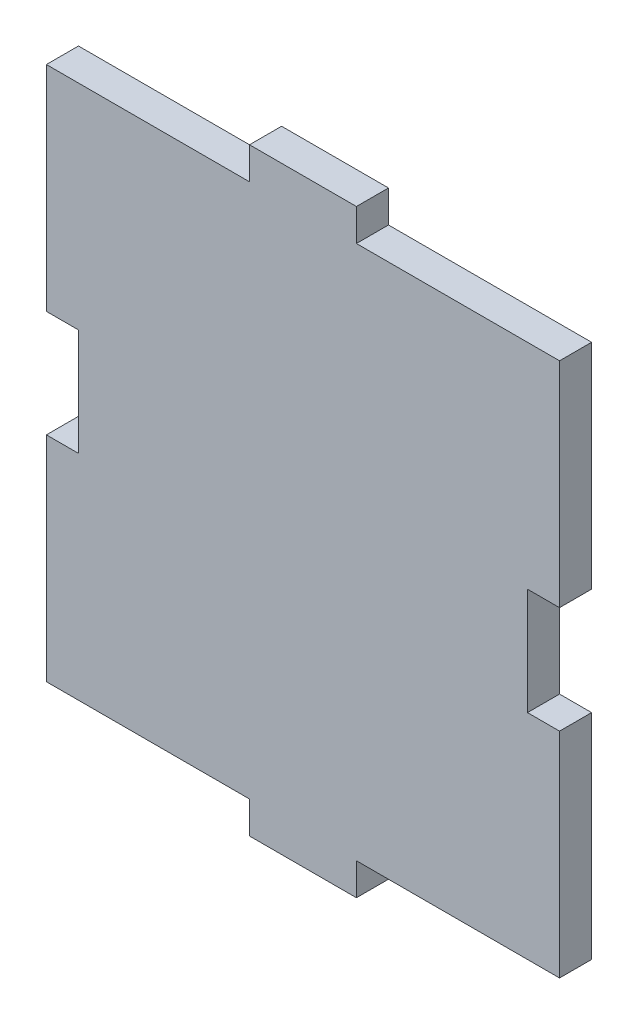
ISO-10303-21;
HEADER;
FILE_DESCRIPTION(('STEP AP214'),'2;1');
FILE_NAME('part.step','',(''),(''),'','','');
FILE_SCHEMA(('AUTOMOTIVE_DESIGN { 1 0 10303 214 1 1 1 1 }'));
ENDSEC;
DATA;
#1=APPLICATION_CONTEXT('core data for automotive mechanical design processes');
#2=APPLICATION_PROTOCOL_DEFINITION('international standard','automotive_design',2000,#1);
#3=PRODUCT_CONTEXT('',#1,'mechanical');
#4=PRODUCT('Part','Part','',(#3));
#5=PRODUCT_RELATED_PRODUCT_CATEGORY('part','',(#4));
#6=PRODUCT_DEFINITION_FORMATION('','',#4);
#7=PRODUCT_DEFINITION_CONTEXT('part definition',#1,'design');
#8=PRODUCT_DEFINITION('design','',#6,#7);
#9=PRODUCT_DEFINITION_SHAPE('','',#8);
#10=(LENGTH_UNIT() NAMED_UNIT(*) SI_UNIT(.MILLI.,.METRE.));
#11=(NAMED_UNIT(*) PLANE_ANGLE_UNIT() SI_UNIT($,.RADIAN.));
#12=(NAMED_UNIT(*) SI_UNIT($,.STERADIAN.) SOLID_ANGLE_UNIT());
#13=UNCERTAINTY_MEASURE_WITH_UNIT(LENGTH_MEASURE(1.E-05),#10,'distance_accuracy_value','');
#14=(GEOMETRIC_REPRESENTATION_CONTEXT(3) GLOBAL_UNCERTAINTY_ASSIGNED_CONTEXT((#13)) GLOBAL_UNIT_ASSIGNED_CONTEXT((#10,
#11,#12)) REPRESENTATION_CONTEXT('',''));
#15=CARTESIAN_POINT('',(0.,0.,0.));
#16=DIRECTION('',(0.,0.,1.));
#17=DIRECTION('',(1.,0.,0.));
#18=AXIS2_PLACEMENT_3D('',#15,#16,#17);
#19=CARTESIAN_POINT('',(-5.00000000000001,25.,3.));
#20=DIRECTION('',(0.,-1.,0.));
#21=DIRECTION('',(1.,0.,0.));
#22=AXIS2_PLACEMENT_3D('',#19,#20,#21);
#23=PLANE('',#22);
#24=DIRECTION('',(-1.,0.,0.));
#25=VECTOR('',#24,1.);
#26=CARTESIAN_POINT('',(-5.00000000000001,25.,0.));
#27=LINE('',#26,#25);
#28=CARTESIAN_POINT('',(-5.00000000000001,25.,0.));
#29=VERTEX_POINT('',#28);
#30=CARTESIAN_POINT('',(-24.,25.,0.));
#31=VERTEX_POINT('',#30);
#32=EDGE_CURVE('E204',#29,#31,#27,.T.);
#33=ORIENTED_EDGE('',*,*,#32,.T.);
#34=DIRECTION('',(0.,0.,-1.));
#35=VECTOR('',#34,1.);
#36=CARTESIAN_POINT('',(-24.,25.,3.));
#37=LINE('',#36,#35);
#38=CARTESIAN_POINT('',(-24.,25.,3.));
#39=VERTEX_POINT('',#38);
#40=EDGE_CURVE('E11',#39,#31,#37,.T.);
#41=ORIENTED_EDGE('',*,*,#40,.F.);
#42=DIRECTION('',(-1.,0.,0.));
#43=VECTOR('',#42,1.);
#44=CARTESIAN_POINT('',(-5.00000000000001,25.,3.));
#45=LINE('',#44,#43);
#46=CARTESIAN_POINT('',(-5.00000000000001,25.,3.));
#47=VERTEX_POINT('',#46);
#48=EDGE_CURVE('E242',#47,#39,#45,.T.);
#49=ORIENTED_EDGE('',*,*,#48,.F.);
#50=DIRECTION('',(0.,0.,-1.));
#51=VECTOR('',#50,1.);
#52=CARTESIAN_POINT('',(-5.00000000000001,25.,3.));
#53=LINE('',#52,#51);
#54=EDGE_CURVE('E200',#47,#29,#53,.T.);
#55=ORIENTED_EDGE('',*,*,#54,.T.);
#56=EDGE_LOOP('',(#33,#41,#49,#55));
#57=FACE_BOUND('',#56,.T.);
#58=ADVANCED_FACE('F36',(#57),#23,.F.);
#59=CARTESIAN_POINT('',(-24.,5.,3.));
#60=DIRECTION('',(1.,0.,0.));
#61=DIRECTION('',(0.,0.,-1.));
#62=AXIS2_PLACEMENT_3D('',#59,#60,#61);
#63=PLANE('',#62);
#64=DIRECTION('',(0.,-1.,0.));
#65=VECTOR('',#64,1.);
#66=CARTESIAN_POINT('',(-24.,5.,0.));
#67=LINE('',#66,#65);
#68=CARTESIAN_POINT('',(-24.,5.,0.));
#69=VERTEX_POINT('',#68);
#70=EDGE_CURVE('E207',#31,#69,#67,.T.);
#71=ORIENTED_EDGE('',*,*,#70,.T.);
#72=DIRECTION('',(0.,0.,-1.));
#73=VECTOR('',#72,1.);
#74=CARTESIAN_POINT('',(-24.,5.,3.));
#75=LINE('',#74,#73);
#76=CARTESIAN_POINT('',(-24.,5.,3.));
#77=VERTEX_POINT('',#76);
#78=EDGE_CURVE('E44',#77,#69,#75,.T.);
#79=ORIENTED_EDGE('',*,*,#78,.F.);
#80=DIRECTION('',(0.,-1.,0.));
#81=VECTOR('',#80,1.);
#82=CARTESIAN_POINT('',(-24.,5.,3.));
#83=LINE('',#82,#81);
#84=EDGE_CURVE('E131',#39,#77,#83,.T.);
#85=ORIENTED_EDGE('',*,*,#84,.F.);
#86=ORIENTED_EDGE('',*,*,#40,.T.);
#87=EDGE_LOOP('',(#71,#79,#85,#86));
#88=FACE_BOUND('',#87,.T.);
#89=ADVANCED_FACE('F360',(#88),#63,.F.);
#90=CARTESIAN_POINT('',(-21.,5.,3.));
#91=DIRECTION('',(0.,1.,0.));
#92=DIRECTION('',(-1.,0.,0.));
#93=AXIS2_PLACEMENT_3D('',#90,#91,#92);
#94=PLANE('',#93);
#95=DIRECTION('',(1.,0.,0.));
#96=VECTOR('',#95,1.);
#97=CARTESIAN_POINT('',(-21.,5.,0.));
#98=LINE('',#97,#96);
#99=CARTESIAN_POINT('',(-21.,5.,0.));
#100=VERTEX_POINT('',#99);
#101=EDGE_CURVE('E209',#69,#100,#98,.T.);
#102=ORIENTED_EDGE('',*,*,#101,.T.);
#103=DIRECTION('',(0.,0.,-1.));
#104=VECTOR('',#103,1.);
#105=CARTESIAN_POINT('',(-21.,5.,3.));
#106=LINE('',#105,#104);
#107=CARTESIAN_POINT('',(-21.,5.,3.));
#108=VERTEX_POINT('',#107);
#109=EDGE_CURVE('E285',#108,#100,#106,.T.);
#110=ORIENTED_EDGE('',*,*,#109,.F.);
#111=DIRECTION('',(1.,0.,0.));
#112=VECTOR('',#111,1.);
#113=CARTESIAN_POINT('',(-21.,5.,3.));
#114=LINE('',#113,#112);
#115=EDGE_CURVE('E293',#77,#108,#114,.T.);
#116=ORIENTED_EDGE('',*,*,#115,.F.);
#117=ORIENTED_EDGE('',*,*,#78,.T.);
#118=EDGE_LOOP('',(#102,#110,#116,#117));
#119=FACE_BOUND('',#118,.T.);
#120=ADVANCED_FACE('F291',(#119),#94,.F.);
#121=CARTESIAN_POINT('',(-21.,-5.,3.));
#122=DIRECTION('',(1.,0.,0.));
#123=DIRECTION('',(0.,0.,-1.));
#124=AXIS2_PLACEMENT_3D('',#121,#122,#123);
#125=PLANE('',#124);
#126=DIRECTION('',(0.,-1.,0.));
#127=VECTOR('',#126,1.);
#128=CARTESIAN_POINT('',(-21.,-5.,0.));
#129=LINE('',#128,#127);
#130=CARTESIAN_POINT('',(-21.,-5.,0.));
#131=VERTEX_POINT('',#130);
#132=EDGE_CURVE('E211',#100,#131,#129,.T.);
#133=ORIENTED_EDGE('',*,*,#132,.T.);
#134=DIRECTION('',(0.,0.,-1.));
#135=VECTOR('',#134,1.);
#136=CARTESIAN_POINT('',(-21.,-5.,3.));
#137=LINE('',#136,#135);
#138=CARTESIAN_POINT('',(-21.,-5.,3.));
#139=VERTEX_POINT('',#138);
#140=EDGE_CURVE('E282',#139,#131,#137,.T.);
#141=ORIENTED_EDGE('',*,*,#140,.F.);
#142=DIRECTION('',(0.,-1.,0.));
#143=VECTOR('',#142,1.);
#144=CARTESIAN_POINT('',(-21.,-5.,3.));
#145=LINE('',#144,#143);
#146=EDGE_CURVE('E311',#108,#139,#145,.T.);
#147=ORIENTED_EDGE('',*,*,#146,.F.);
#148=ORIENTED_EDGE('',*,*,#109,.T.);
#149=EDGE_LOOP('',(#133,#141,#147,#148));
#150=FACE_BOUND('',#149,.T.);
#151=ADVANCED_FACE('F302',(#150),#125,.F.);
#152=CARTESIAN_POINT('',(-24.,-5.,3.));
#153=DIRECTION('',(0.,-1.,0.));
#154=DIRECTION('',(0.,0.,-1.));
#155=AXIS2_PLACEMENT_3D('',#152,#153,#154);
#156=PLANE('',#155);
#157=DIRECTION('',(-1.,0.,0.));
#158=VECTOR('',#157,1.);
#159=CARTESIAN_POINT('',(-24.,-5.,0.));
#160=LINE('',#159,#158);
#161=CARTESIAN_POINT('',(-24.,-5.,0.));
#162=VERTEX_POINT('',#161);
#163=EDGE_CURVE('E213',#131,#162,#160,.T.);
#164=ORIENTED_EDGE('',*,*,#163,.T.);
#165=DIRECTION('',(0.,0.,-1.));
#166=VECTOR('',#165,1.);
#167=CARTESIAN_POINT('',(-24.,-5.,3.));
#168=LINE('',#167,#166);
#169=CARTESIAN_POINT('',(-24.,-5.,3.));
#170=VERTEX_POINT('',#169);
#171=EDGE_CURVE('E279',#170,#162,#168,.T.);
#172=ORIENTED_EDGE('',*,*,#171,.F.);
#173=DIRECTION('',(-1.,0.,0.));
#174=VECTOR('',#173,1.);
#175=CARTESIAN_POINT('',(-24.,-5.,3.));
#176=LINE('',#175,#174);
#177=EDGE_CURVE('E308',#139,#170,#176,.T.);
#178=ORIENTED_EDGE('',*,*,#177,.F.);
#179=ORIENTED_EDGE('',*,*,#140,.T.);
#180=EDGE_LOOP('',(#164,#172,#178,#179));
#181=FACE_BOUND('',#180,.T.);
#182=ADVANCED_FACE('F306',(#181),#156,.F.);
#183=CARTESIAN_POINT('',(-24.,-25.,3.));
#184=DIRECTION('',(1.,0.,0.));
#185=DIRECTION('',(0.,1.,0.));
#186=AXIS2_PLACEMENT_3D('',#183,#184,#185);
#187=PLANE('',#186);
#188=DIRECTION('',(0.,-1.,0.));
#189=VECTOR('',#188,1.);
#190=CARTESIAN_POINT('',(-24.,-25.,0.));
#191=LINE('',#190,#189);
#192=CARTESIAN_POINT('',(-24.,-25.,0.));
#193=VERTEX_POINT('',#192);
#194=EDGE_CURVE('E215',#162,#193,#191,.T.);
#195=ORIENTED_EDGE('',*,*,#194,.T.);
#196=DIRECTION('',(0.,0.,-1.));
#197=VECTOR('',#196,1.);
#198=CARTESIAN_POINT('',(-24.,-25.,3.));
#199=LINE('',#198,#197);
#200=CARTESIAN_POINT('',(-24.,-25.,3.));
#201=VERTEX_POINT('',#200);
#202=EDGE_CURVE('E276',#201,#193,#199,.T.);
#203=ORIENTED_EDGE('',*,*,#202,.F.);
#204=DIRECTION('',(0.,-1.,0.));
#205=VECTOR('',#204,1.);
#206=CARTESIAN_POINT('',(-24.,-25.,3.));
#207=LINE('',#206,#205);
#208=EDGE_CURVE('E310',#170,#201,#207,.T.);
#209=ORIENTED_EDGE('',*,*,#208,.F.);
#210=ORIENTED_EDGE('',*,*,#171,.T.);
#211=EDGE_LOOP('',(#195,#203,#209,#210));
#212=FACE_BOUND('',#211,.T.);
#213=ADVANCED_FACE('F373',(#212),#187,.F.);
#214=CARTESIAN_POINT('',(-5.,-25.,3.));
#215=DIRECTION('',(0.,1.,0.));
#216=DIRECTION('',(-1.,0.,0.));
#217=AXIS2_PLACEMENT_3D('',#214,#215,#216);
#218=PLANE('',#217);
#219=DIRECTION('',(1.,0.,0.));
#220=VECTOR('',#219,1.);
#221=CARTESIAN_POINT('',(-5.,-25.,0.));
#222=LINE('',#221,#220);
#223=CARTESIAN_POINT('',(-5.,-25.,0.));
#224=VERTEX_POINT('',#223);
#225=EDGE_CURVE('E217',#193,#224,#222,.T.);
#226=ORIENTED_EDGE('',*,*,#225,.T.);
#227=DIRECTION('',(0.,0.,-1.));
#228=VECTOR('',#227,1.);
#229=CARTESIAN_POINT('',(-5.,-25.,3.));
#230=LINE('',#229,#228);
#231=CARTESIAN_POINT('',(-5.,-25.,3.));
#232=VERTEX_POINT('',#231);
#233=EDGE_CURVE('E273',#232,#224,#230,.T.);
#234=ORIENTED_EDGE('',*,*,#233,.F.);
#235=DIRECTION('',(1.,0.,0.));
#236=VECTOR('',#235,1.);
#237=CARTESIAN_POINT('',(-5.,-25.,3.));
#238=LINE('',#237,#236);
#239=EDGE_CURVE('E313',#201,#232,#238,.T.);
#240=ORIENTED_EDGE('',*,*,#239,.F.);
#241=ORIENTED_EDGE('',*,*,#202,.T.);
#242=EDGE_LOOP('',(#226,#234,#240,#241));
#243=FACE_BOUND('',#242,.T.);
#244=ADVANCED_FACE('F376',(#243),#218,.F.);
#245=CARTESIAN_POINT('',(-5.,-25.,3.));
#246=DIRECTION('',(1.,0.,0.));
#247=DIRECTION('',(0.,0.,-1.));
#248=AXIS2_PLACEMENT_3D('',#245,#246,#247);
#249=PLANE('',#248);
#250=DIRECTION('',(0.,-1.,0.));
#251=VECTOR('',#250,1.);
#252=CARTESIAN_POINT('',(-5.,-25.,0.));
#253=LINE('',#252,#251);
#254=CARTESIAN_POINT('',(-5.,-28.,0.));
#255=VERTEX_POINT('',#254);
#256=EDGE_CURVE('E219',#224,#255,#253,.T.);
#257=ORIENTED_EDGE('',*,*,#256,.T.);
#258=DIRECTION('',(0.,0.,-1.));
#259=VECTOR('',#258,1.);
#260=CARTESIAN_POINT('',(-5.,-28.,3.));
#261=LINE('',#260,#259);
#262=CARTESIAN_POINT('',(-5.,-28.,3.));
#263=VERTEX_POINT('',#262);
#264=EDGE_CURVE('E270',#263,#255,#261,.T.);
#265=ORIENTED_EDGE('',*,*,#264,.F.);
#266=DIRECTION('',(0.,-1.,0.));
#267=VECTOR('',#266,1.);
#268=CARTESIAN_POINT('',(-5.,-25.,3.));
#269=LINE('',#268,#267);
#270=EDGE_CURVE('E319',#232,#263,#269,.T.);
#271=ORIENTED_EDGE('',*,*,#270,.F.);
#272=ORIENTED_EDGE('',*,*,#233,.T.);
#273=EDGE_LOOP('',(#257,#265,#271,#272));
#274=FACE_BOUND('',#273,.T.);
#275=ADVANCED_FACE('F380',(#274),#249,.F.);
#276=CARTESIAN_POINT('',(-5.,-28.,3.));
#277=DIRECTION('',(0.,1.,0.));
#278=DIRECTION('',(0.,0.,1.));
#279=AXIS2_PLACEMENT_3D('',#276,#277,#278);
#280=PLANE('',#279);
#281=DIRECTION('',(1.,0.,0.));
#282=VECTOR('',#281,1.);
#283=CARTESIAN_POINT('',(-5.,-28.,0.));
#284=LINE('',#283,#282);
#285=CARTESIAN_POINT('',(5.,-28.,0.));
#286=VERTEX_POINT('',#285);
#287=EDGE_CURVE('E221',#255,#286,#284,.T.);
#288=ORIENTED_EDGE('',*,*,#287,.T.);
#289=DIRECTION('',(0.,0.,-1.));
#290=VECTOR('',#289,1.);
#291=CARTESIAN_POINT('',(5.,-28.,3.));
#292=LINE('',#291,#290);
#293=CARTESIAN_POINT('',(5.,-28.,3.));
#294=VERTEX_POINT('',#293);
#295=EDGE_CURVE('E267',#294,#286,#292,.T.);
#296=ORIENTED_EDGE('',*,*,#295,.F.);
#297=DIRECTION('',(1.,0.,0.));
#298=VECTOR('',#297,1.);
#299=CARTESIAN_POINT('',(-5.,-28.,3.));
#300=LINE('',#299,#298);
#301=EDGE_CURVE('E321',#263,#294,#300,.T.);
#302=ORIENTED_EDGE('',*,*,#301,.F.);
#303=ORIENTED_EDGE('',*,*,#264,.T.);
#304=EDGE_LOOP('',(#288,#296,#302,#303));
#305=FACE_BOUND('',#304,.T.);
#306=ADVANCED_FACE('F384',(#305),#280,.F.);
#307=CARTESIAN_POINT('',(5.,-28.,3.));
#308=DIRECTION('',(-1.,0.,0.));
#309=DIRECTION('',(0.,0.,1.));
#310=AXIS2_PLACEMENT_3D('',#307,#308,#309);
#311=PLANE('',#310);
#312=DIRECTION('',(0.,1.,0.));
#313=VECTOR('',#312,1.);
#314=CARTESIAN_POINT('',(5.,-28.,0.));
#315=LINE('',#314,#313);
#316=CARTESIAN_POINT('',(5.,-25.,0.));
#317=VERTEX_POINT('',#316);
#318=EDGE_CURVE('E223',#286,#317,#315,.T.);
#319=ORIENTED_EDGE('',*,*,#318,.T.);
#320=DIRECTION('',(0.,0.,-1.));
#321=VECTOR('',#320,1.);
#322=CARTESIAN_POINT('',(5.,-25.,3.));
#323=LINE('',#322,#321);
#324=CARTESIAN_POINT('',(5.,-25.,3.));
#325=VERTEX_POINT('',#324);
#326=EDGE_CURVE('E264',#325,#317,#323,.T.);
#327=ORIENTED_EDGE('',*,*,#326,.F.);
#328=DIRECTION('',(0.,1.,0.));
#329=VECTOR('',#328,1.);
#330=CARTESIAN_POINT('',(5.,-28.,3.));
#331=LINE('',#330,#329);
#332=EDGE_CURVE('E323',#294,#325,#331,.T.);
#333=ORIENTED_EDGE('',*,*,#332,.F.);
#334=ORIENTED_EDGE('',*,*,#295,.T.);
#335=EDGE_LOOP('',(#319,#327,#333,#334));
#336=FACE_BOUND('',#335,.T.);
#337=ADVANCED_FACE('F388',(#336),#311,.F.);
#338=CARTESIAN_POINT('',(24.,-25.,3.));
#339=DIRECTION('',(0.,1.,0.));
#340=DIRECTION('',(-1.,0.,0.));
#341=AXIS2_PLACEMENT_3D('',#338,#339,#340);
#342=PLANE('',#341);
#343=DIRECTION('',(1.,0.,0.));
#344=VECTOR('',#343,1.);
#345=CARTESIAN_POINT('',(24.,-25.,0.));
#346=LINE('',#345,#344);
#347=CARTESIAN_POINT('',(24.,-25.,0.));
#348=VERTEX_POINT('',#347);
#349=EDGE_CURVE('E225',#317,#348,#346,.T.);
#350=ORIENTED_EDGE('',*,*,#349,.T.);
#351=DIRECTION('',(0.,0.,-1.));
#352=VECTOR('',#351,1.);
#353=CARTESIAN_POINT('',(24.,-25.,3.));
#354=LINE('',#353,#352);
#355=CARTESIAN_POINT('',(24.,-25.,3.));
#356=VERTEX_POINT('',#355);
#357=EDGE_CURVE('E261',#356,#348,#354,.T.);
#358=ORIENTED_EDGE('',*,*,#357,.F.);
#359=DIRECTION('',(1.,0.,0.));
#360=VECTOR('',#359,1.);
#361=CARTESIAN_POINT('',(24.,-25.,3.));
#362=LINE('',#361,#360);
#363=EDGE_CURVE('E325',#325,#356,#362,.T.);
#364=ORIENTED_EDGE('',*,*,#363,.F.);
#365=ORIENTED_EDGE('',*,*,#326,.T.);
#366=EDGE_LOOP('',(#350,#358,#364,#365));
#367=FACE_BOUND('',#366,.T.);
#368=ADVANCED_FACE('F392',(#367),#342,.F.);
#369=CARTESIAN_POINT('',(24.,-25.,3.));
#370=DIRECTION('',(-1.,0.,0.));
#371=DIRECTION('',(0.,-1.,0.));
#372=AXIS2_PLACEMENT_3D('',#369,#370,#371);
#373=PLANE('',#372);
#374=DIRECTION('',(0.,1.,0.));
#375=VECTOR('',#374,1.);
#376=CARTESIAN_POINT('',(24.,-25.,0.));
#377=LINE('',#376,#375);
#378=CARTESIAN_POINT('',(24.,-5.,0.));
#379=VERTEX_POINT('',#378);
#380=EDGE_CURVE('E227',#348,#379,#377,.T.);
#381=ORIENTED_EDGE('',*,*,#380,.T.);
#382=DIRECTION('',(0.,0.,-1.));
#383=VECTOR('',#382,1.);
#384=CARTESIAN_POINT('',(24.,-5.,3.));
#385=LINE('',#384,#383);
#386=CARTESIAN_POINT('',(24.,-5.,3.));
#387=VERTEX_POINT('',#386);
#388=EDGE_CURVE('E258',#387,#379,#385,.T.);
#389=ORIENTED_EDGE('',*,*,#388,.F.);
#390=DIRECTION('',(0.,1.,0.));
#391=VECTOR('',#390,1.);
#392=CARTESIAN_POINT('',(24.,-25.,3.));
#393=LINE('',#392,#391);
#394=EDGE_CURVE('E327',#356,#387,#393,.T.);
#395=ORIENTED_EDGE('',*,*,#394,.F.);
#396=ORIENTED_EDGE('',*,*,#357,.T.);
#397=EDGE_LOOP('',(#381,#389,#395,#396));
#398=FACE_BOUND('',#397,.T.);
#399=ADVANCED_FACE('F396',(#398),#373,.F.);
#400=CARTESIAN_POINT('',(24.,-5.,3.));
#401=DIRECTION('',(0.,-1.,0.));
#402=DIRECTION('',(0.,0.,-1.));
#403=AXIS2_PLACEMENT_3D('',#400,#401,#402);
#404=PLANE('',#403);
#405=DIRECTION('',(-1.,0.,0.));
#406=VECTOR('',#405,1.);
#407=CARTESIAN_POINT('',(24.,-5.,0.));
#408=LINE('',#407,#406);
#409=CARTESIAN_POINT('',(21.,-5.,0.));
#410=VERTEX_POINT('',#409);
#411=EDGE_CURVE('E229',#379,#410,#408,.T.);
#412=ORIENTED_EDGE('',*,*,#411,.T.);
#413=DIRECTION('',(0.,0.,-1.));
#414=VECTOR('',#413,1.);
#415=CARTESIAN_POINT('',(21.,-5.,3.));
#416=LINE('',#415,#414);
#417=CARTESIAN_POINT('',(21.,-5.,3.));
#418=VERTEX_POINT('',#417);
#419=EDGE_CURVE('E255',#418,#410,#416,.T.);
#420=ORIENTED_EDGE('',*,*,#419,.F.);
#421=DIRECTION('',(-1.,0.,0.));
#422=VECTOR('',#421,1.);
#423=CARTESIAN_POINT('',(24.,-5.,3.));
#424=LINE('',#423,#422);
#425=EDGE_CURVE('E329',#387,#418,#424,.T.);
#426=ORIENTED_EDGE('',*,*,#425,.F.);
#427=ORIENTED_EDGE('',*,*,#388,.T.);
#428=EDGE_LOOP('',(#412,#420,#426,#427));
#429=FACE_BOUND('',#428,.T.);
#430=ADVANCED_FACE('F400',(#429),#404,.F.);
#431=CARTESIAN_POINT('',(21.,-5.,3.));
#432=DIRECTION('',(-1.,0.,0.));
#433=DIRECTION('',(0.,0.,1.));
#434=AXIS2_PLACEMENT_3D('',#431,#432,#433);
#435=PLANE('',#434);
#436=DIRECTION('',(0.,1.,0.));
#437=VECTOR('',#436,1.);
#438=CARTESIAN_POINT('',(21.,-5.,0.));
#439=LINE('',#438,#437);
#440=CARTESIAN_POINT('',(21.,5.,0.));
#441=VERTEX_POINT('',#440);
#442=EDGE_CURVE('E231',#410,#441,#439,.T.);
#443=ORIENTED_EDGE('',*,*,#442,.T.);
#444=DIRECTION('',(0.,0.,-1.));
#445=VECTOR('',#444,1.);
#446=CARTESIAN_POINT('',(21.,5.,3.));
#447=LINE('',#446,#445);
#448=CARTESIAN_POINT('',(21.,5.,3.));
#449=VERTEX_POINT('',#448);
#450=EDGE_CURVE('E252',#449,#441,#447,.T.);
#451=ORIENTED_EDGE('',*,*,#450,.F.);
#452=DIRECTION('',(0.,1.,0.));
#453=VECTOR('',#452,1.);
#454=CARTESIAN_POINT('',(21.,-5.,3.));
#455=LINE('',#454,#453);
#456=EDGE_CURVE('E331',#418,#449,#455,.T.);
#457=ORIENTED_EDGE('',*,*,#456,.F.);
#458=ORIENTED_EDGE('',*,*,#419,.T.);
#459=EDGE_LOOP('',(#443,#451,#457,#458));
#460=FACE_BOUND('',#459,.T.);
#461=ADVANCED_FACE('F404',(#460),#435,.F.);
#462=CARTESIAN_POINT('',(21.,5.,3.));
#463=DIRECTION('',(0.,1.,0.));
#464=DIRECTION('',(-1.,0.,0.));
#465=AXIS2_PLACEMENT_3D('',#462,#463,#464);
#466=PLANE('',#465);
#467=DIRECTION('',(1.,0.,0.));
#468=VECTOR('',#467,1.);
#469=CARTESIAN_POINT('',(21.,5.,0.));
#470=LINE('',#469,#468);
#471=CARTESIAN_POINT('',(24.,5.,0.));
#472=VERTEX_POINT('',#471);
#473=EDGE_CURVE('E233',#441,#472,#470,.T.);
#474=ORIENTED_EDGE('',*,*,#473,.T.);
#475=DIRECTION('',(0.,0.,-1.));
#476=VECTOR('',#475,1.);
#477=CARTESIAN_POINT('',(24.,5.,3.));
#478=LINE('',#477,#476);
#479=CARTESIAN_POINT('',(24.,5.,3.));
#480=VERTEX_POINT('',#479);
#481=EDGE_CURVE('E249',#480,#472,#478,.T.);
#482=ORIENTED_EDGE('',*,*,#481,.F.);
#483=DIRECTION('',(1.,0.,0.));
#484=VECTOR('',#483,1.);
#485=CARTESIAN_POINT('',(21.,5.,3.));
#486=LINE('',#485,#484);
#487=EDGE_CURVE('E333',#449,#480,#486,.T.);
#488=ORIENTED_EDGE('',*,*,#487,.F.);
#489=ORIENTED_EDGE('',*,*,#450,.T.);
#490=EDGE_LOOP('',(#474,#482,#488,#489));
#491=FACE_BOUND('',#490,.T.);
#492=ADVANCED_FACE('F408',(#491),#466,.F.);
#493=CARTESIAN_POINT('',(24.,5.,3.));
#494=DIRECTION('',(-1.,0.,0.));
#495=DIRECTION('',(0.,0.,1.));
#496=AXIS2_PLACEMENT_3D('',#493,#494,#495);
#497=PLANE('',#496);
#498=DIRECTION('',(0.,1.,0.));
#499=VECTOR('',#498,1.);
#500=CARTESIAN_POINT('',(24.,5.,0.));
#501=LINE('',#500,#499);
#502=CARTESIAN_POINT('',(24.,25.,0.));
#503=VERTEX_POINT('',#502);
#504=EDGE_CURVE('E235',#472,#503,#501,.T.);
#505=ORIENTED_EDGE('',*,*,#504,.T.);
#506=DIRECTION('',(0.,0.,-1.));
#507=VECTOR('',#506,1.);
#508=CARTESIAN_POINT('',(24.,25.,3.));
#509=LINE('',#508,#507);
#510=CARTESIAN_POINT('',(24.,25.,3.));
#511=VERTEX_POINT('',#510);
#512=EDGE_CURVE('E246',#511,#503,#509,.T.);
#513=ORIENTED_EDGE('',*,*,#512,.F.);
#514=DIRECTION('',(0.,1.,0.));
#515=VECTOR('',#514,1.);
#516=CARTESIAN_POINT('',(24.,5.,3.));
#517=LINE('',#516,#515);
#518=EDGE_CURVE('E335',#480,#511,#517,.T.);
#519=ORIENTED_EDGE('',*,*,#518,.F.);
#520=ORIENTED_EDGE('',*,*,#481,.T.);
#521=EDGE_LOOP('',(#505,#513,#519,#520));
#522=FACE_BOUND('',#521,.T.);
#523=ADVANCED_FACE('F341',(#522),#497,.F.);
#524=CARTESIAN_POINT('',(24.,25.,3.));
#525=DIRECTION('',(0.,-1.,0.));
#526=DIRECTION('',(1.,0.,0.));
#527=AXIS2_PLACEMENT_3D('',#524,#525,#526);
#528=PLANE('',#527);
#529=DIRECTION('',(-1.,0.,0.));
#530=VECTOR('',#529,1.);
#531=CARTESIAN_POINT('',(24.,25.,0.));
#532=LINE('',#531,#530);
#533=CARTESIAN_POINT('',(4.99999999999999,25.,0.));
#534=VERTEX_POINT('',#533);
#535=EDGE_CURVE('E237',#503,#534,#532,.T.);
#536=ORIENTED_EDGE('',*,*,#535,.T.);
#537=DIRECTION('',(0.,0.,-1.));
#538=VECTOR('',#537,1.);
#539=CARTESIAN_POINT('',(4.99999999999999,25.,3.));
#540=LINE('',#539,#538);
#541=CARTESIAN_POINT('',(4.99999999999999,25.,3.));
#542=VERTEX_POINT('',#541);
#543=EDGE_CURVE('E195',#542,#534,#540,.T.);
#544=ORIENTED_EDGE('',*,*,#543,.F.);
#545=DIRECTION('',(-1.,0.,0.));
#546=VECTOR('',#545,1.);
#547=CARTESIAN_POINT('',(24.,25.,3.));
#548=LINE('',#547,#546);
#549=EDGE_CURVE('E186',#511,#542,#548,.T.);
#550=ORIENTED_EDGE('',*,*,#549,.F.);
#551=ORIENTED_EDGE('',*,*,#512,.T.);
#552=EDGE_LOOP('',(#536,#544,#550,#551));
#553=FACE_BOUND('',#552,.T.);
#554=ADVANCED_FACE('F345',(#553),#528,.F.);
#555=CARTESIAN_POINT('',(4.99999999999999,28.,3.));
#556=DIRECTION('',(-1.,0.,0.));
#557=DIRECTION('',(0.,0.,1.));
#558=AXIS2_PLACEMENT_3D('',#555,#556,#557);
#559=PLANE('',#558);
#560=DIRECTION('',(0.,1.,0.));
#561=VECTOR('',#560,1.);
#562=CARTESIAN_POINT('',(4.99999999999999,28.,0.));
#563=LINE('',#562,#561);
#564=CARTESIAN_POINT('',(4.99999999999999,28.,0.));
#565=VERTEX_POINT('',#564);
#566=EDGE_CURVE('E194',#534,#565,#563,.T.);
#567=ORIENTED_EDGE('',*,*,#566,.T.);
#568=DIRECTION('',(0.,0.,-1.));
#569=VECTOR('',#568,1.);
#570=CARTESIAN_POINT('',(4.99999999999999,28.,3.));
#571=LINE('',#570,#569);
#572=CARTESIAN_POINT('',(4.99999999999999,28.,3.));
#573=VERTEX_POINT('',#572);
#574=EDGE_CURVE('E191',#573,#565,#571,.T.);
#575=ORIENTED_EDGE('',*,*,#574,.F.);
#576=DIRECTION('',(0.,1.,0.));
#577=VECTOR('',#576,1.);
#578=CARTESIAN_POINT('',(4.99999999999999,28.,3.));
#579=LINE('',#578,#577);
#580=EDGE_CURVE('E180',#542,#573,#579,.T.);
#581=ORIENTED_EDGE('',*,*,#580,.F.);
#582=ORIENTED_EDGE('',*,*,#543,.T.);
#583=EDGE_LOOP('',(#567,#575,#581,#582));
#584=FACE_BOUND('',#583,.T.);
#585=ADVANCED_FACE('F192',(#584),#559,.F.);
#586=CARTESIAN_POINT('',(-5.00000000000001,28.,3.));
#587=DIRECTION('',(0.,-1.,0.));
#588=DIRECTION('',(0.,0.,-1.));
#589=AXIS2_PLACEMENT_3D('',#586,#587,#588);
#590=PLANE('',#589);
#591=DIRECTION('',(-1.,0.,0.));
#592=VECTOR('',#591,1.);
#593=CARTESIAN_POINT('',(-5.00000000000001,28.,0.));
#594=LINE('',#593,#592);
#595=CARTESIAN_POINT('',(-5.00000000000001,28.,0.));
#596=VERTEX_POINT('',#595);
#597=EDGE_CURVE('E117',#565,#596,#594,.T.);
#598=ORIENTED_EDGE('',*,*,#597,.T.);
#599=DIRECTION('',(0.,0.,-1.));
#600=VECTOR('',#599,1.);
#601=CARTESIAN_POINT('',(-5.00000000000001,28.,3.));
#602=LINE('',#601,#600);
#603=CARTESIAN_POINT('',(-5.00000000000001,28.,3.));
#604=VERTEX_POINT('',#603);
#605=EDGE_CURVE('E196',#604,#596,#602,.T.);
#606=ORIENTED_EDGE('',*,*,#605,.F.);
#607=DIRECTION('',(-1.,0.,0.));
#608=VECTOR('',#607,1.);
#609=CARTESIAN_POINT('',(-5.00000000000001,28.,3.));
#610=LINE('',#609,#608);
#611=EDGE_CURVE('E184',#573,#604,#610,.T.);
#612=ORIENTED_EDGE('',*,*,#611,.F.);
#613=ORIENTED_EDGE('',*,*,#574,.T.);
#614=EDGE_LOOP('',(#598,#606,#612,#613));
#615=FACE_BOUND('',#614,.T.);
#616=ADVANCED_FACE('F198',(#615),#590,.F.);
#617=CARTESIAN_POINT('',(-5.00000000000001,25.,3.));
#618=DIRECTION('',(1.,0.,0.));
#619=DIRECTION('',(0.,0.,-1.));
#620=AXIS2_PLACEMENT_3D('',#617,#618,#619);
#621=PLANE('',#620);
#622=DIRECTION('',(0.,-1.,0.));
#623=VECTOR('',#622,1.);
#624=CARTESIAN_POINT('',(-5.00000000000001,25.,0.));
#625=LINE('',#624,#623);
#626=EDGE_CURVE('E123',#596,#29,#625,.T.);
#627=ORIENTED_EDGE('',*,*,#626,.T.);
#628=ORIENTED_EDGE('',*,*,#54,.F.);
#629=DIRECTION('',(0.,-1.,0.));
#630=VECTOR('',#629,1.);
#631=CARTESIAN_POINT('',(-5.00000000000001,25.,3.));
#632=LINE('',#631,#630);
#633=EDGE_CURVE('E52',#604,#47,#632,.T.);
#634=ORIENTED_EDGE('',*,*,#633,.F.);
#635=ORIENTED_EDGE('',*,*,#605,.T.);
#636=EDGE_LOOP('',(#627,#628,#634,#635));
#637=FACE_BOUND('',#636,.T.);
#638=ADVANCED_FACE('F349',(#637),#621,.F.);
#639=CARTESIAN_POINT('',(0.,0.,3.));
#640=DIRECTION('',(0.,0.,-1.));
#641=DIRECTION('',(-1.,0.,0.));
#642=AXIS2_PLACEMENT_3D('',#639,#640,#641);
#643=PLANE('',#642);
#644=ORIENTED_EDGE('',*,*,#48,.T.);
#645=ORIENTED_EDGE('',*,*,#84,.T.);
#646=ORIENTED_EDGE('',*,*,#115,.T.);
#647=ORIENTED_EDGE('',*,*,#146,.T.);
#648=ORIENTED_EDGE('',*,*,#177,.T.);
#649=ORIENTED_EDGE('',*,*,#208,.T.);
#650=ORIENTED_EDGE('',*,*,#239,.T.);
#651=ORIENTED_EDGE('',*,*,#270,.T.);
#652=ORIENTED_EDGE('',*,*,#301,.T.);
#653=ORIENTED_EDGE('',*,*,#332,.T.);
#654=ORIENTED_EDGE('',*,*,#363,.T.);
#655=ORIENTED_EDGE('',*,*,#394,.T.);
#656=ORIENTED_EDGE('',*,*,#425,.T.);
#657=ORIENTED_EDGE('',*,*,#456,.T.);
#658=ORIENTED_EDGE('',*,*,#487,.T.);
#659=ORIENTED_EDGE('',*,*,#518,.T.);
#660=ORIENTED_EDGE('',*,*,#549,.T.);
#661=ORIENTED_EDGE('',*,*,#580,.T.);
#662=ORIENTED_EDGE('',*,*,#611,.T.);
#663=ORIENTED_EDGE('',*,*,#633,.T.);
#664=EDGE_LOOP('',(#644,#645,#646,#647,#648,#649,#650,#651,#652,#653,#654,#655,#656,#657,#658,
#659,#660,#661,#662,#663));
#665=FACE_BOUND('',#664,.T.);
#666=ADVANCED_FACE('F182',(#665),#643,.F.);
#667=CARTESIAN_POINT('',(0.,0.,0.));
#668=DIRECTION('',(0.,0.,-1.));
#669=DIRECTION('',(-1.,0.,0.));
#670=AXIS2_PLACEMENT_3D('',#667,#668,#669);
#671=PLANE('',#670);
#672=ORIENTED_EDGE('',*,*,#32,.F.);
#673=ORIENTED_EDGE('',*,*,#626,.F.);
#674=ORIENTED_EDGE('',*,*,#597,.F.);
#675=ORIENTED_EDGE('',*,*,#566,.F.);
#676=ORIENTED_EDGE('',*,*,#535,.F.);
#677=ORIENTED_EDGE('',*,*,#504,.F.);
#678=ORIENTED_EDGE('',*,*,#473,.F.);
#679=ORIENTED_EDGE('',*,*,#442,.F.);
#680=ORIENTED_EDGE('',*,*,#411,.F.);
#681=ORIENTED_EDGE('',*,*,#380,.F.);
#682=ORIENTED_EDGE('',*,*,#349,.F.);
#683=ORIENTED_EDGE('',*,*,#318,.F.);
#684=ORIENTED_EDGE('',*,*,#287,.F.);
#685=ORIENTED_EDGE('',*,*,#256,.F.);
#686=ORIENTED_EDGE('',*,*,#225,.F.);
#687=ORIENTED_EDGE('',*,*,#194,.F.);
#688=ORIENTED_EDGE('',*,*,#163,.F.);
#689=ORIENTED_EDGE('',*,*,#132,.F.);
#690=ORIENTED_EDGE('',*,*,#101,.F.);
#691=ORIENTED_EDGE('',*,*,#70,.F.);
#692=EDGE_LOOP('',(#672,#673,#674,#675,#676,#677,#678,#679,#680,#681,#682,#683,#684,#685,#686,
#687,#688,#689,#690,#691));
#693=FACE_BOUND('',#692,.T.);
#694=ADVANCED_FACE('F297',(#693),#671,.T.);
#695=CLOSED_SHELL('',(#58,#89,#120,#151,#182,#213,#244,#275,#306,#337,#368,#399,#430,#461,#492,
#523,#554,#585,#616,#638,#666,#694));
#696=MANIFOLD_SOLID_BREP('B2',#695);
#697=ADVANCED_BREP_SHAPE_REPRESENTATION('',(#18,#696),#14);
#698=SHAPE_DEFINITION_REPRESENTATION(#9,#697);
ENDSEC;
END-ISO-10303-21;
